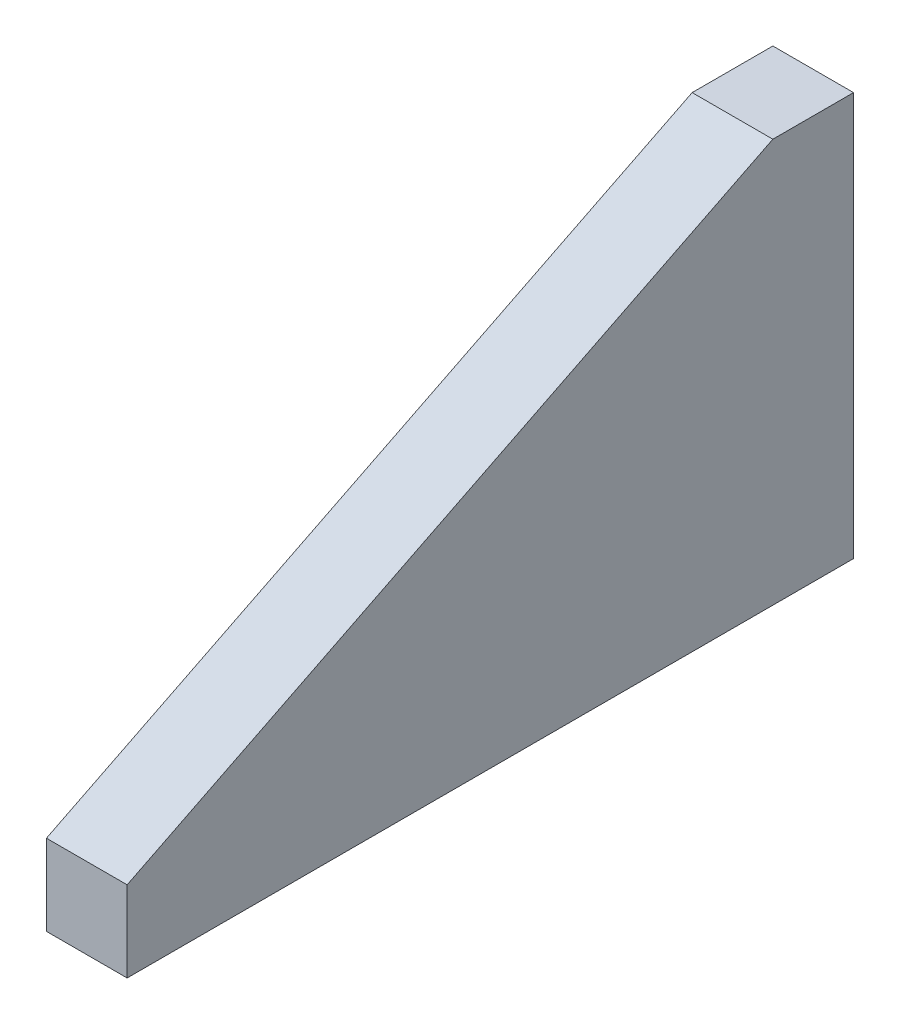
ISO-10303-21;
HEADER;
FILE_DESCRIPTION(('STEP AP214'),'2;1');
FILE_NAME('part.step','',(''),(''),'','','');
FILE_SCHEMA(('AUTOMOTIVE_DESIGN { 1 0 10303 214 1 1 1 1 }'));
ENDSEC;
DATA;
#1=APPLICATION_CONTEXT('core data for automotive mechanical design processes');
#2=APPLICATION_PROTOCOL_DEFINITION('international standard','automotive_design',2000,#1);
#3=PRODUCT_CONTEXT('',#1,'mechanical');
#4=PRODUCT('Part','Part','',(#3));
#5=PRODUCT_RELATED_PRODUCT_CATEGORY('part','',(#4));
#6=PRODUCT_DEFINITION_FORMATION('','',#4);
#7=PRODUCT_DEFINITION_CONTEXT('part definition',#1,'design');
#8=PRODUCT_DEFINITION('design','',#6,#7);
#9=PRODUCT_DEFINITION_SHAPE('','',#8);
#10=(LENGTH_UNIT() NAMED_UNIT(*) SI_UNIT(.MILLI.,.METRE.));
#11=(NAMED_UNIT(*) PLANE_ANGLE_UNIT() SI_UNIT($,.RADIAN.));
#12=(NAMED_UNIT(*) SI_UNIT($,.STERADIAN.) SOLID_ANGLE_UNIT());
#13=UNCERTAINTY_MEASURE_WITH_UNIT(LENGTH_MEASURE(1.E-05),#10,'distance_accuracy_value','');
#14=(GEOMETRIC_REPRESENTATION_CONTEXT(3) GLOBAL_UNCERTAINTY_ASSIGNED_CONTEXT((#13)) GLOBAL_UNIT_ASSIGNED_CONTEXT((#10,
#11,#12)) REPRESENTATION_CONTEXT('',''));
#15=CARTESIAN_POINT('',(0.,0.,0.));
#16=DIRECTION('',(0.,0.,1.));
#17=DIRECTION('',(1.,0.,0.));
#18=AXIS2_PLACEMENT_3D('',#15,#16,#17);
#19=CARTESIAN_POINT('',(-241.3,63.5,609.6));
#20=DIRECTION('',(-1.,0.,0.));
#21=DIRECTION('',(0.,0.,1.));
#22=AXIS2_PLACEMENT_3D('',#19,#20,#21);
#23=PLANE('',#22);
#24=DIRECTION('',(0.,0.447213595499958,-0.894427190999916));
#25=VECTOR('',#24,1.);
#26=CARTESIAN_POINT('',(-241.3,12.7,723.9));
#27=LINE('',#26,#25);
#28=CARTESIAN_POINT('',(-241.3,63.5,622.3));
#29=VERTEX_POINT('',#28);
#30=CARTESIAN_POINT('',(-241.3,12.7,723.9));
#31=VERTEX_POINT('',#30);
#32=EDGE_CURVE('E87',#29,#31,#27,.F.);
#33=ORIENTED_EDGE('',*,*,#32,.T.);
#34=DIRECTION('',(0.,1.,0.));
#35=VECTOR('',#34,1.);
#36=CARTESIAN_POINT('',(-241.3,63.5,723.9));
#37=LINE('',#36,#35);
#38=CARTESIAN_POINT('',(-241.3,0.,723.9));
#39=VERTEX_POINT('',#38);
#40=EDGE_CURVE('E74',#31,#39,#37,.F.);
#41=ORIENTED_EDGE('',*,*,#40,.T.);
#42=DIRECTION('',(0.,0.,1.));
#43=VECTOR('',#42,1.);
#44=CARTESIAN_POINT('',(-241.3,0.,0.));
#45=LINE('',#44,#43);
#46=CARTESIAN_POINT('',(-241.3,0.,609.6));
#47=VERTEX_POINT('',#46);
#48=EDGE_CURVE('E19',#39,#47,#45,.F.);
#49=ORIENTED_EDGE('',*,*,#48,.T.);
#50=DIRECTION('',(0.,1.,0.));
#51=VECTOR('',#50,1.);
#52=CARTESIAN_POINT('',(-241.3,63.5,609.6));
#53=LINE('',#52,#51);
#54=CARTESIAN_POINT('',(-241.3,63.5,609.6));
#55=VERTEX_POINT('',#54);
#56=EDGE_CURVE('E64',#47,#55,#53,.T.);
#57=ORIENTED_EDGE('',*,*,#56,.T.);
#58=DIRECTION('',(0.,0.,1.));
#59=VECTOR('',#58,1.);
#60=CARTESIAN_POINT('',(-241.3,63.5,0.));
#61=LINE('',#60,#59);
#62=EDGE_CURVE('E59',#29,#55,#61,.F.);
#63=ORIENTED_EDGE('',*,*,#62,.F.);
#64=EDGE_LOOP('',(#33,#41,#49,#57,#63));
#65=FACE_BOUND('',#64,.T.);
#66=ADVANCED_FACE('F16',(#65),#23,.F.);
#67=CARTESIAN_POINT('',(0.,0.,0.));
#68=DIRECTION('',(0.,1.,0.));
#69=DIRECTION('',(0.,0.,1.));
#70=AXIS2_PLACEMENT_3D('',#67,#68,#69);
#71=PLANE('',#70);
#72=DIRECTION('',(1.,0.,0.));
#73=VECTOR('',#72,1.);
#74=CARTESIAN_POINT('',(-254.,0.,609.6));
#75=LINE('',#74,#73);
#76=CARTESIAN_POINT('',(-254.,0.,609.6));
#77=VERTEX_POINT('',#76);
#78=EDGE_CURVE('E69',#77,#47,#75,.T.);
#79=ORIENTED_EDGE('',*,*,#78,.T.);
#80=ORIENTED_EDGE('',*,*,#48,.F.);
#81=DIRECTION('',(-1.,0.,0.));
#82=VECTOR('',#81,1.);
#83=CARTESIAN_POINT('',(-254.,0.,723.9));
#84=LINE('',#83,#82);
#85=CARTESIAN_POINT('',(-254.,0.,723.9));
#86=VERTEX_POINT('',#85);
#87=EDGE_CURVE('E89',#39,#86,#84,.T.);
#88=ORIENTED_EDGE('',*,*,#87,.T.);
#89=DIRECTION('',(0.,0.,-1.));
#90=VECTOR('',#89,1.);
#91=CARTESIAN_POINT('',(-254.,0.,609.6));
#92=LINE('',#91,#90);
#93=EDGE_CURVE('E80',#86,#77,#92,.T.);
#94=ORIENTED_EDGE('',*,*,#93,.T.);
#95=EDGE_LOOP('',(#79,#80,#88,#94));
#96=FACE_BOUND('',#95,.T.);
#97=ADVANCED_FACE('F79',(#96),#71,.F.);
#98=CARTESIAN_POINT('',(-254.,63.5,609.6));
#99=DIRECTION('',(0.,0.,1.));
#100=DIRECTION('',(1.,0.,0.));
#101=AXIS2_PLACEMENT_3D('',#98,#99,#100);
#102=PLANE('',#101);
#103=DIRECTION('',(0.,1.,0.));
#104=VECTOR('',#103,1.);
#105=CARTESIAN_POINT('',(-254.,63.5,609.6));
#106=LINE('',#105,#104);
#107=CARTESIAN_POINT('',(-254.,63.5,609.6));
#108=VERTEX_POINT('',#107);
#109=EDGE_CURVE('E94',#77,#108,#106,.T.);
#110=ORIENTED_EDGE('',*,*,#109,.T.);
#111=DIRECTION('',(1.,0.,0.));
#112=VECTOR('',#111,1.);
#113=CARTESIAN_POINT('',(0.,63.5,609.6));
#114=LINE('',#113,#112);
#115=EDGE_CURVE('E71',#55,#108,#114,.F.);
#116=ORIENTED_EDGE('',*,*,#115,.F.);
#117=ORIENTED_EDGE('',*,*,#56,.F.);
#118=ORIENTED_EDGE('',*,*,#78,.F.);
#119=EDGE_LOOP('',(#110,#116,#117,#118));
#120=FACE_BOUND('',#119,.T.);
#121=ADVANCED_FACE('F67',(#120),#102,.F.);
#122=CARTESIAN_POINT('',(0.,63.5,0.));
#123=DIRECTION('',(0.,1.,0.));
#124=DIRECTION('',(0.,0.,1.));
#125=AXIS2_PLACEMENT_3D('',#122,#123,#124);
#126=PLANE('',#125);
#127=ORIENTED_EDGE('',*,*,#115,.T.);
#128=DIRECTION('',(0.,0.,-1.));
#129=VECTOR('',#128,1.);
#130=CARTESIAN_POINT('',(-254.,63.5,609.6));
#131=LINE('',#130,#129);
#132=CARTESIAN_POINT('',(-254.,63.5,622.3));
#133=VERTEX_POINT('',#132);
#134=EDGE_CURVE('E96',#108,#133,#131,.F.);
#135=ORIENTED_EDGE('',*,*,#134,.T.);
#136=DIRECTION('',(1.,0.,0.));
#137=VECTOR('',#136,1.);
#138=CARTESIAN_POINT('',(-457.2,63.5,622.3));
#139=LINE('',#138,#137);
#140=EDGE_CURVE('E85',#133,#29,#139,.T.);
#141=ORIENTED_EDGE('',*,*,#140,.T.);
#142=ORIENTED_EDGE('',*,*,#62,.T.);
#143=EDGE_LOOP('',(#127,#135,#141,#142));
#144=FACE_BOUND('',#143,.T.);
#145=ADVANCED_FACE('F107',(#144),#126,.T.);
#146=CARTESIAN_POINT('',(-457.2,12.7,723.9));
#147=DIRECTION('',(0.,-0.894427190999916,-0.447213595499958));
#148=DIRECTION('',(0.,0.447213595499958,-0.894427190999916));
#149=AXIS2_PLACEMENT_3D('',#146,#147,#148);
#150=PLANE('',#149);
#151=ORIENTED_EDGE('',*,*,#32,.F.);
#152=ORIENTED_EDGE('',*,*,#140,.F.);
#153=DIRECTION('',(0.,-0.447213595499958,0.894427190999916));
#154=VECTOR('',#153,1.);
#155=CARTESIAN_POINT('',(-254.,63.5,622.3));
#156=LINE('',#155,#154);
#157=CARTESIAN_POINT('',(-254.,12.7,723.9));
#158=VERTEX_POINT('',#157);
#159=EDGE_CURVE('E25',#133,#158,#156,.T.);
#160=ORIENTED_EDGE('',*,*,#159,.T.);
#161=DIRECTION('',(-1.,0.,0.));
#162=VECTOR('',#161,1.);
#163=CARTESIAN_POINT('',(-254.,12.7,723.9));
#164=LINE('',#163,#162);
#165=EDGE_CURVE('E33',#158,#31,#164,.F.);
#166=ORIENTED_EDGE('',*,*,#165,.T.);
#167=EDGE_LOOP('',(#151,#152,#160,#166));
#168=FACE_BOUND('',#167,.T.);
#169=ADVANCED_FACE('F103',(#168),#150,.F.);
#170=CARTESIAN_POINT('',(-254.,63.5,723.9));
#171=DIRECTION('',(0.,0.,-1.));
#172=DIRECTION('',(-1.,0.,0.));
#173=AXIS2_PLACEMENT_3D('',#170,#171,#172);
#174=PLANE('',#173);
#175=ORIENTED_EDGE('',*,*,#165,.F.);
#176=DIRECTION('',(0.,1.,0.));
#177=VECTOR('',#176,1.);
#178=CARTESIAN_POINT('',(-254.,63.5,723.9));
#179=LINE('',#178,#177);
#180=EDGE_CURVE('E11',#158,#86,#179,.F.);
#181=ORIENTED_EDGE('',*,*,#180,.T.);
#182=ORIENTED_EDGE('',*,*,#87,.F.);
#183=ORIENTED_EDGE('',*,*,#40,.F.);
#184=EDGE_LOOP('',(#175,#181,#182,#183));
#185=FACE_BOUND('',#184,.T.);
#186=ADVANCED_FACE('F115',(#185),#174,.F.);
#187=CARTESIAN_POINT('',(-254.,63.5,609.6));
#188=DIRECTION('',(1.,0.,0.));
#189=DIRECTION('',(0.,0.,-1.));
#190=AXIS2_PLACEMENT_3D('',#187,#188,#189);
#191=PLANE('',#190);
#192=ORIENTED_EDGE('',*,*,#159,.F.);
#193=ORIENTED_EDGE('',*,*,#134,.F.);
#194=ORIENTED_EDGE('',*,*,#109,.F.);
#195=ORIENTED_EDGE('',*,*,#93,.F.);
#196=ORIENTED_EDGE('',*,*,#180,.F.);
#197=EDGE_LOOP('',(#192,#193,#194,#195,#196));
#198=FACE_BOUND('',#197,.T.);
#199=ADVANCED_FACE('F106',(#198),#191,.F.);
#200=CLOSED_SHELL('',(#66,#97,#121,#145,#169,#186,#199));
#201=MANIFOLD_SOLID_BREP('B1',#200);
#202=ADVANCED_BREP_SHAPE_REPRESENTATION('',(#18,#201),#14);
#203=SHAPE_DEFINITION_REPRESENTATION(#9,#202);
ENDSEC;
END-ISO-10303-21;
